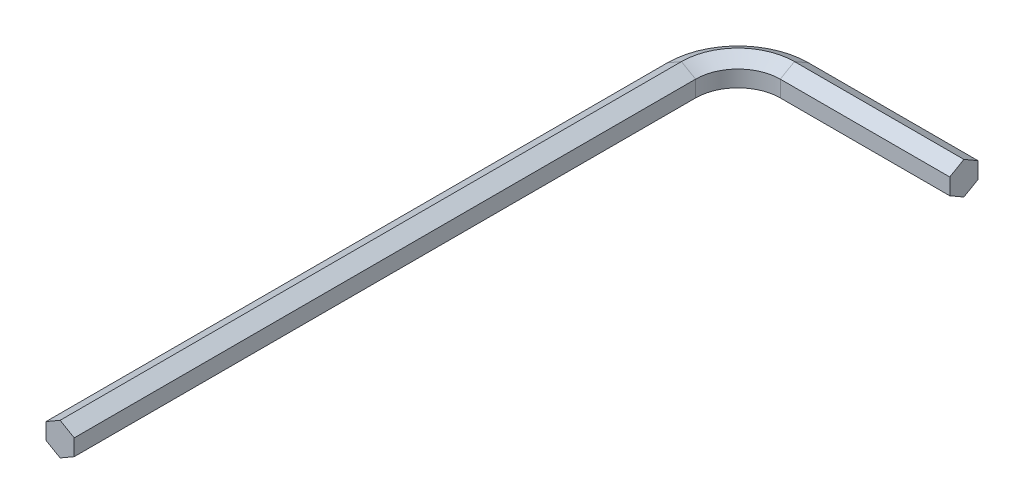
ISO-10303-21;
HEADER;
FILE_DESCRIPTION(('STEP AP214'),'2;1');
FILE_NAME('part.step','',(''),(''),'','','');
FILE_SCHEMA(('AUTOMOTIVE_DESIGN { 1 0 10303 214 1 1 1 1 }'));
ENDSEC;
DATA;
#1=APPLICATION_CONTEXT('core data for automotive mechanical design processes');
#2=APPLICATION_PROTOCOL_DEFINITION('international standard','automotive_design',2000,#1);
#3=PRODUCT_CONTEXT('',#1,'mechanical');
#4=PRODUCT('Part','Part','',(#3));
#5=PRODUCT_RELATED_PRODUCT_CATEGORY('part','',(#4));
#6=PRODUCT_DEFINITION_FORMATION('','',#4);
#7=PRODUCT_DEFINITION_CONTEXT('part definition',#1,'design');
#8=PRODUCT_DEFINITION('design','',#6,#7);
#9=PRODUCT_DEFINITION_SHAPE('','',#8);
#10=(LENGTH_UNIT() NAMED_UNIT(*) SI_UNIT(.MILLI.,.METRE.));
#11=(NAMED_UNIT(*) PLANE_ANGLE_UNIT() SI_UNIT($,.RADIAN.));
#12=(NAMED_UNIT(*) SI_UNIT($,.STERADIAN.) SOLID_ANGLE_UNIT());
#13=UNCERTAINTY_MEASURE_WITH_UNIT(LENGTH_MEASURE(1.E-05),#10,'distance_accuracy_value','');
#14=(GEOMETRIC_REPRESENTATION_CONTEXT(3) GLOBAL_UNCERTAINTY_ASSIGNED_CONTEXT((#13)) GLOBAL_UNIT_ASSIGNED_CONTEXT((#10,
#11,#12)) REPRESENTATION_CONTEXT('',''));
#15=CARTESIAN_POINT('',(0.,0.,0.));
#16=DIRECTION('',(0.,0.,1.));
#17=DIRECTION('',(1.,0.,0.));
#18=AXIS2_PLACEMENT_3D('',#15,#16,#17);
#19=CARTESIAN_POINT('',(5.,-0.721687836487033,-58.75));
#20=DIRECTION('',(0.,0.,-1.));
#21=DIRECTION('',(-1.,0.,0.));
#22=AXIS2_PLACEMENT_3D('',#19,#20,#21);
#23=PLANE('',#22);
#24=DIRECTION('',(0.,1.,0.));
#25=VECTOR('',#24,1.);
#26=CARTESIAN_POINT('',(5.,-0.721687836487033,-58.75));
#27=LINE('',#26,#25);
#28=CARTESIAN_POINT('',(5.,-0.721687836487033,-58.75));
#29=VERTEX_POINT('',#28);
#30=CARTESIAN_POINT('',(5.,0.721687836487033,-58.75));
#31=VERTEX_POINT('',#30);
#32=EDGE_CURVE('E135',#29,#31,#27,.T.);
#33=ORIENTED_EDGE('',*,*,#32,.F.);
#34=DIRECTION('',(1.,0.,0.));
#35=VECTOR('',#34,1.);
#36=CARTESIAN_POINT('',(5.,-0.721687836487033,-58.75));
#37=LINE('',#36,#35);
#38=CARTESIAN_POINT('',(20.,-0.721687836487033,-58.75));
#39=VERTEX_POINT('',#38);
#40=EDGE_CURVE('E40',#29,#39,#37,.T.);
#41=ORIENTED_EDGE('',*,*,#40,.T.);
#42=DIRECTION('',(0.,1.,0.));
#43=VECTOR('',#42,1.);
#44=CARTESIAN_POINT('',(20.,-0.721687836487033,-58.75));
#45=LINE('',#44,#43);
#46=CARTESIAN_POINT('',(20.,0.721687836487033,-58.75));
#47=VERTEX_POINT('',#46);
#48=EDGE_CURVE('E47',#39,#47,#45,.T.);
#49=ORIENTED_EDGE('',*,*,#48,.T.);
#50=DIRECTION('',(1.,0.,0.));
#51=VECTOR('',#50,1.);
#52=CARTESIAN_POINT('',(5.,0.721687836487033,-58.75));
#53=LINE('',#52,#51);
#54=EDGE_CURVE('E11',#31,#47,#53,.T.);
#55=ORIENTED_EDGE('',*,*,#54,.F.);
#56=EDGE_LOOP('',(#33,#41,#49,#55));
#57=FACE_BOUND('',#56,.T.);
#58=ADVANCED_FACE('F33',(#57),#23,.F.);
#59=CARTESIAN_POINT('',(5.,-1.44337567297407,-60.));
#60=DIRECTION('',(0.,0.866025403784439,-0.5));
#61=DIRECTION('',(0.,0.5,0.866025403784439));
#62=AXIS2_PLACEMENT_3D('',#59,#60,#61);
#63=PLANE('',#62);
#64=DIRECTION('',(0.,0.5,0.866025403784439));
#65=VECTOR('',#64,1.);
#66=CARTESIAN_POINT('',(5.,-1.44337567297407,-60.));
#67=LINE('',#66,#65);
#68=CARTESIAN_POINT('',(5.,-1.44337567297407,-60.));
#69=VERTEX_POINT('',#68);
#70=EDGE_CURVE('E203',#69,#29,#67,.T.);
#71=ORIENTED_EDGE('',*,*,#70,.F.);
#72=DIRECTION('',(1.,0.,0.));
#73=VECTOR('',#72,1.);
#74=CARTESIAN_POINT('',(5.,-1.44337567297407,-60.));
#75=LINE('',#74,#73);
#76=CARTESIAN_POINT('',(20.,-1.44337567297407,-60.));
#77=VERTEX_POINT('',#76);
#78=EDGE_CURVE('E239',#69,#77,#75,.T.);
#79=ORIENTED_EDGE('',*,*,#78,.T.);
#80=DIRECTION('',(0.,0.5,0.866025403784439));
#81=VECTOR('',#80,1.);
#82=CARTESIAN_POINT('',(20.,-1.44337567297407,-60.));
#83=LINE('',#82,#81);
#84=EDGE_CURVE('E55',#77,#39,#83,.T.);
#85=ORIENTED_EDGE('',*,*,#84,.T.);
#86=ORIENTED_EDGE('',*,*,#40,.F.);
#87=EDGE_LOOP('',(#71,#79,#85,#86));
#88=FACE_BOUND('',#87,.T.);
#89=ADVANCED_FACE('F242',(#88),#63,.F.);
#90=CARTESIAN_POINT('',(5.,-0.721687836487033,-61.25));
#91=DIRECTION('',(0.,0.866025403784439,0.5));
#92=DIRECTION('',(0.,-0.5,0.866025403784439));
#93=AXIS2_PLACEMENT_3D('',#90,#91,#92);
#94=PLANE('',#93);
#95=DIRECTION('',(0.,-0.5,0.866025403784439));
#96=VECTOR('',#95,1.);
#97=CARTESIAN_POINT('',(5.,-0.721687836487033,-61.25));
#98=LINE('',#97,#96);
#99=CARTESIAN_POINT('',(5.,-0.721687836487033,-61.25));
#100=VERTEX_POINT('',#99);
#101=EDGE_CURVE('E200',#100,#69,#98,.T.);
#102=ORIENTED_EDGE('',*,*,#101,.F.);
#103=DIRECTION('',(1.,0.,0.));
#104=VECTOR('',#103,1.);
#105=CARTESIAN_POINT('',(5.,-0.721687836487033,-61.25));
#106=LINE('',#105,#104);
#107=CARTESIAN_POINT('',(20.,-0.721687836487033,-61.25));
#108=VERTEX_POINT('',#107);
#109=EDGE_CURVE('E236',#100,#108,#106,.T.);
#110=ORIENTED_EDGE('',*,*,#109,.T.);
#111=DIRECTION('',(0.,-0.5,0.866025403784439));
#112=VECTOR('',#111,1.);
#113=CARTESIAN_POINT('',(20.,-0.721687836487033,-61.25));
#114=LINE('',#113,#112);
#115=EDGE_CURVE('E226',#108,#77,#114,.T.);
#116=ORIENTED_EDGE('',*,*,#115,.T.);
#117=ORIENTED_EDGE('',*,*,#78,.F.);
#118=EDGE_LOOP('',(#102,#110,#116,#117));
#119=FACE_BOUND('',#118,.T.);
#120=ADVANCED_FACE('F277',(#119),#94,.F.);
#121=CARTESIAN_POINT('',(5.,0.721687836487033,-61.25));
#122=DIRECTION('',(0.,0.,1.));
#123=DIRECTION('',(1.,0.,0.));
#124=AXIS2_PLACEMENT_3D('',#121,#122,#123);
#125=PLANE('',#124);
#126=DIRECTION('',(0.,-1.,0.));
#127=VECTOR('',#126,1.);
#128=CARTESIAN_POINT('',(5.,0.721687836487033,-61.25));
#129=LINE('',#128,#127);
#130=CARTESIAN_POINT('',(5.,0.721687836487033,-61.25));
#131=VERTEX_POINT('',#130);
#132=EDGE_CURVE('E197',#131,#100,#129,.T.);
#133=ORIENTED_EDGE('',*,*,#132,.F.);
#134=DIRECTION('',(1.,0.,0.));
#135=VECTOR('',#134,1.);
#136=CARTESIAN_POINT('',(5.,0.721687836487033,-61.25));
#137=LINE('',#136,#135);
#138=CARTESIAN_POINT('',(20.,0.721687836487033,-61.25));
#139=VERTEX_POINT('',#138);
#140=EDGE_CURVE('E233',#131,#139,#137,.T.);
#141=ORIENTED_EDGE('',*,*,#140,.T.);
#142=DIRECTION('',(0.,-1.,0.));
#143=VECTOR('',#142,1.);
#144=CARTESIAN_POINT('',(20.,0.721687836487033,-61.25));
#145=LINE('',#144,#143);
#146=EDGE_CURVE('E224',#139,#108,#145,.T.);
#147=ORIENTED_EDGE('',*,*,#146,.T.);
#148=ORIENTED_EDGE('',*,*,#109,.F.);
#149=EDGE_LOOP('',(#133,#141,#147,#148));
#150=FACE_BOUND('',#149,.T.);
#151=ADVANCED_FACE('F268',(#150),#125,.F.);
#152=CARTESIAN_POINT('',(5.,1.44337567297407,-60.));
#153=DIRECTION('',(0.,-0.866025403784439,0.5));
#154=DIRECTION('',(0.,-0.5,-0.866025403784439));
#155=AXIS2_PLACEMENT_3D('',#152,#153,#154);
#156=PLANE('',#155);
#157=DIRECTION('',(0.,-0.5,-0.866025403784439));
#158=VECTOR('',#157,1.);
#159=CARTESIAN_POINT('',(5.,1.44337567297407,-60.));
#160=LINE('',#159,#158);
#161=CARTESIAN_POINT('',(5.,1.44337567297407,-60.));
#162=VERTEX_POINT('',#161);
#163=EDGE_CURVE('E195',#162,#131,#160,.T.);
#164=ORIENTED_EDGE('',*,*,#163,.F.);
#165=DIRECTION('',(1.,0.,0.));
#166=VECTOR('',#165,1.);
#167=CARTESIAN_POINT('',(5.,1.44337567297407,-60.));
#168=LINE('',#167,#166);
#169=CARTESIAN_POINT('',(20.,1.44337567297407,-60.));
#170=VERTEX_POINT('',#169);
#171=EDGE_CURVE('E230',#162,#170,#168,.T.);
#172=ORIENTED_EDGE('',*,*,#171,.T.);
#173=DIRECTION('',(0.,-0.5,-0.866025403784439));
#174=VECTOR('',#173,1.);
#175=CARTESIAN_POINT('',(20.,1.44337567297407,-60.));
#176=LINE('',#175,#174);
#177=EDGE_CURVE('E222',#170,#139,#176,.T.);
#178=ORIENTED_EDGE('',*,*,#177,.T.);
#179=ORIENTED_EDGE('',*,*,#140,.F.);
#180=EDGE_LOOP('',(#164,#172,#178,#179));
#181=FACE_BOUND('',#180,.T.);
#182=ADVANCED_FACE('F271',(#181),#156,.F.);
#183=CARTESIAN_POINT('',(5.,0.721687836487033,-58.75));
#184=DIRECTION('',(0.,-0.866025403784439,-0.5));
#185=DIRECTION('',(0.,0.5,-0.866025403784439));
#186=AXIS2_PLACEMENT_3D('',#183,#184,#185);
#187=PLANE('',#186);
#188=DIRECTION('',(0.,0.5,-0.866025403784439));
#189=VECTOR('',#188,1.);
#190=CARTESIAN_POINT('',(5.,0.721687836487033,-58.75));
#191=LINE('',#190,#189);
#192=EDGE_CURVE('E131',#31,#162,#191,.T.);
#193=ORIENTED_EDGE('',*,*,#192,.F.);
#194=ORIENTED_EDGE('',*,*,#54,.T.);
#195=DIRECTION('',(0.,0.5,-0.866025403784439));
#196=VECTOR('',#195,1.);
#197=CARTESIAN_POINT('',(20.,0.721687836487033,-58.75));
#198=LINE('',#197,#196);
#199=EDGE_CURVE('E220',#47,#170,#198,.T.);
#200=ORIENTED_EDGE('',*,*,#199,.T.);
#201=ORIENTED_EDGE('',*,*,#171,.F.);
#202=EDGE_LOOP('',(#193,#194,#200,#201));
#203=FACE_BOUND('',#202,.T.);
#204=ADVANCED_FACE('F311',(#203),#187,.F.);
#205=CARTESIAN_POINT('',(5.,0.,-55.));
#206=DIRECTION('',(0.,-1.,0.));
#207=DIRECTION('',(0.,0.,-1.));
#208=AXIS2_PLACEMENT_3D('',#205,#206,#207);
#209=CYLINDRICAL_SURFACE('',#208,3.75);
#210=DIRECTION('',(0.,1.,0.));
#211=VECTOR('',#210,1.);
#212=CARTESIAN_POINT('',(1.25,-0.721687836487033,-55.));
#213=LINE('',#212,#211);
#214=CARTESIAN_POINT('',(1.25,-0.721687836487033,-55.));
#215=VERTEX_POINT('',#214);
#216=CARTESIAN_POINT('',(1.25,0.721687836487033,-55.));
#217=VERTEX_POINT('',#216);
#218=EDGE_CURVE('E155',#215,#217,#213,.T.);
#219=ORIENTED_EDGE('',*,*,#218,.F.);
#220=CARTESIAN_POINT('',(5.,-0.721687836487033,-55.));
#221=DIRECTION('',(0.,-1.,0.));
#222=DIRECTION('',(0.,0.,-1.));
#223=AXIS2_PLACEMENT_3D('',#220,#221,#222);
#224=CIRCLE('',#223,3.75);
#225=EDGE_CURVE('E215',#215,#29,#224,.T.);
#226=ORIENTED_EDGE('',*,*,#225,.T.);
#227=ORIENTED_EDGE('',*,*,#32,.T.);
#228=CARTESIAN_POINT('',(5.,0.721687836487033,-55.));
#229=DIRECTION('',(0.,-1.,0.));
#230=DIRECTION('',(0.,0.,-1.));
#231=AXIS2_PLACEMENT_3D('',#228,#229,#230);
#232=CIRCLE('',#231,3.75);
#233=EDGE_CURVE('E218',#217,#31,#232,.T.);
#234=ORIENTED_EDGE('',*,*,#233,.F.);
#235=EDGE_LOOP('',(#219,#226,#227,#234));
#236=FACE_BOUND('',#235,.T.);
#237=ADVANCED_FACE('F320',(#236),#209,.F.);
#238=CARTESIAN_POINT('',(5.,-1.44337567297407,-55.));
#239=DIRECTION('',(0.,-1.,0.));
#240=DIRECTION('',(0.,0.,-1.));
#241=AXIS2_PLACEMENT_3D('',#238,#239,#240);
#242=CONICAL_SURFACE('',#241,5.,1.0471975511966);
#243=DIRECTION('',(0.866025403784439,0.5,0.));
#244=VECTOR('',#243,1.);
#245=CARTESIAN_POINT('',(0.,-1.44337567297407,-55.));
#246=LINE('',#245,#244);
#247=CARTESIAN_POINT('',(0.,-1.44337567297407,-55.));
#248=VERTEX_POINT('',#247);
#249=EDGE_CURVE('E171',#248,#215,#246,.T.);
#250=ORIENTED_EDGE('',*,*,#249,.F.);
#251=CARTESIAN_POINT('',(5.,-1.44337567297407,-55.));
#252=DIRECTION('',(0.,-1.,0.));
#253=DIRECTION('',(0.,0.,-1.));
#254=AXIS2_PLACEMENT_3D('',#251,#252,#253);
#255=CIRCLE('',#254,5.);
#256=EDGE_CURVE('E212',#248,#69,#255,.T.);
#257=ORIENTED_EDGE('',*,*,#256,.T.);
#258=ORIENTED_EDGE('',*,*,#70,.T.);
#259=ORIENTED_EDGE('',*,*,#225,.F.);
#260=EDGE_LOOP('',(#250,#257,#258,#259));
#261=FACE_BOUND('',#260,.T.);
#262=ADVANCED_FACE('F250',(#261),#242,.F.);
#263=CARTESIAN_POINT('',(5.,-0.721687836487033,-55.));
#264=DIRECTION('',(0.,1.,0.));
#265=DIRECTION('',(0.,0.,1.));
#266=AXIS2_PLACEMENT_3D('',#263,#264,#265);
#267=CONICAL_SURFACE('',#266,6.25,1.0471975511966);
#268=DIRECTION('',(0.866025403784439,-0.5,0.));
#269=VECTOR('',#268,1.);
#270=CARTESIAN_POINT('',(-1.25,-0.721687836487033,-55.));
#271=LINE('',#270,#269);
#272=CARTESIAN_POINT('',(-1.25,-0.721687836487033,-55.));
#273=VERTEX_POINT('',#272);
#274=EDGE_CURVE('E168',#273,#248,#271,.T.);
#275=ORIENTED_EDGE('',*,*,#274,.F.);
#276=CARTESIAN_POINT('',(5.,-0.721687836487033,-55.));
#277=DIRECTION('',(0.,-1.,0.));
#278=DIRECTION('',(0.,0.,-1.));
#279=AXIS2_PLACEMENT_3D('',#276,#277,#278);
#280=CIRCLE('',#279,6.25);
#281=EDGE_CURVE('E209',#273,#100,#280,.T.);
#282=ORIENTED_EDGE('',*,*,#281,.T.);
#283=ORIENTED_EDGE('',*,*,#101,.T.);
#284=ORIENTED_EDGE('',*,*,#256,.F.);
#285=EDGE_LOOP('',(#275,#282,#283,#284));
#286=FACE_BOUND('',#285,.T.);
#287=ADVANCED_FACE('F247',(#286),#267,.T.);
#288=CARTESIAN_POINT('',(5.,0.,-55.));
#289=DIRECTION('',(0.,-1.,0.));
#290=DIRECTION('',(0.,0.,-1.));
#291=AXIS2_PLACEMENT_3D('',#288,#289,#290);
#292=CYLINDRICAL_SURFACE('',#291,6.25);
#293=DIRECTION('',(0.,-1.,0.));
#294=VECTOR('',#293,1.);
#295=CARTESIAN_POINT('',(-1.25,0.721687836487033,-55.));
#296=LINE('',#295,#294);
#297=CARTESIAN_POINT('',(-1.25,0.721687836487033,-55.));
#298=VERTEX_POINT('',#297);
#299=EDGE_CURVE('E144',#298,#273,#296,.T.);
#300=ORIENTED_EDGE('',*,*,#299,.F.);
#301=CARTESIAN_POINT('',(5.,0.721687836487033,-55.));
#302=DIRECTION('',(0.,-1.,0.));
#303=DIRECTION('',(0.,0.,-1.));
#304=AXIS2_PLACEMENT_3D('',#301,#302,#303);
#305=CIRCLE('',#304,6.25);
#306=EDGE_CURVE('E134',#298,#131,#305,.T.);
#307=ORIENTED_EDGE('',*,*,#306,.T.);
#308=ORIENTED_EDGE('',*,*,#132,.T.);
#309=ORIENTED_EDGE('',*,*,#281,.F.);
#310=EDGE_LOOP('',(#300,#307,#308,#309));
#311=FACE_BOUND('',#310,.T.);
#312=ADVANCED_FACE('F265',(#311),#292,.T.);
#313=CARTESIAN_POINT('',(5.,1.44337567297407,-55.));
#314=DIRECTION('',(0.,-1.,0.));
#315=DIRECTION('',(0.,0.,-1.));
#316=AXIS2_PLACEMENT_3D('',#313,#314,#315);
#317=CONICAL_SURFACE('',#316,5.,1.0471975511966);
#318=DIRECTION('',(-0.866025403784439,-0.5,0.));
#319=VECTOR('',#318,1.);
#320=CARTESIAN_POINT('',(0.,1.44337567297407,-55.));
#321=LINE('',#320,#319);
#322=CARTESIAN_POINT('',(0.,1.44337567297407,-55.));
#323=VERTEX_POINT('',#322);
#324=EDGE_CURVE('E138',#323,#298,#321,.T.);
#325=ORIENTED_EDGE('',*,*,#324,.F.);
#326=CARTESIAN_POINT('',(5.,1.44337567297407,-55.));
#327=DIRECTION('',(0.,-1.,0.));
#328=DIRECTION('',(0.,0.,-1.));
#329=AXIS2_PLACEMENT_3D('',#326,#327,#328);
#330=CIRCLE('',#329,5.);
#331=EDGE_CURVE('E123',#323,#162,#330,.T.);
#332=ORIENTED_EDGE('',*,*,#331,.T.);
#333=ORIENTED_EDGE('',*,*,#163,.T.);
#334=ORIENTED_EDGE('',*,*,#306,.F.);
#335=EDGE_LOOP('',(#325,#332,#333,#334));
#336=FACE_BOUND('',#335,.T.);
#337=ADVANCED_FACE('F140',(#336),#317,.T.);
#338=CARTESIAN_POINT('',(5.,0.721687836487033,-55.));
#339=DIRECTION('',(0.,1.,0.));
#340=DIRECTION('',(0.,0.,1.));
#341=AXIS2_PLACEMENT_3D('',#338,#339,#340);
#342=CONICAL_SURFACE('',#341,3.75,1.0471975511966);
#343=DIRECTION('',(-0.866025403784439,0.5,0.));
#344=VECTOR('',#343,1.);
#345=CARTESIAN_POINT('',(1.25,0.721687836487033,-55.));
#346=LINE('',#345,#344);
#347=EDGE_CURVE('E128',#217,#323,#346,.T.);
#348=ORIENTED_EDGE('',*,*,#347,.F.);
#349=ORIENTED_EDGE('',*,*,#233,.T.);
#350=ORIENTED_EDGE('',*,*,#192,.T.);
#351=ORIENTED_EDGE('',*,*,#331,.F.);
#352=EDGE_LOOP('',(#348,#349,#350,#351));
#353=FACE_BOUND('',#352,.T.);
#354=ADVANCED_FACE('F125',(#353),#342,.F.);
#355=CARTESIAN_POINT('',(1.25,0.721687836487033,-55.));
#356=DIRECTION('',(0.5,0.866025403784439,0.));
#357=DIRECTION('',(-0.866025403784439,0.5,0.));
#358=AXIS2_PLACEMENT_3D('',#355,#356,#357);
#359=PLANE('',#358);
#360=DIRECTION('',(-0.866025403784439,0.5,0.));
#361=VECTOR('',#360,1.);
#362=CARTESIAN_POINT('',(1.25,0.721687836487033,0.));
#363=LINE('',#362,#361);
#364=CARTESIAN_POINT('',(1.25,0.721687836487033,0.));
#365=VERTEX_POINT('',#364);
#366=CARTESIAN_POINT('',(0.,1.44337567297407,0.));
#367=VERTEX_POINT('',#366);
#368=EDGE_CURVE('E175',#365,#367,#363,.T.);
#369=ORIENTED_EDGE('',*,*,#368,.F.);
#370=DIRECTION('',(0.,0.,1.));
#371=VECTOR('',#370,1.);
#372=CARTESIAN_POINT('',(1.25,0.721687836487033,-55.));
#373=LINE('',#372,#371);
#374=EDGE_CURVE('E158',#217,#365,#373,.T.);
#375=ORIENTED_EDGE('',*,*,#374,.F.);
#376=ORIENTED_EDGE('',*,*,#347,.T.);
#377=DIRECTION('',(0.,0.,1.));
#378=VECTOR('',#377,1.);
#379=CARTESIAN_POINT('',(0.,1.44337567297407,-55.));
#380=LINE('',#379,#378);
#381=EDGE_CURVE('E147',#323,#367,#380,.T.);
#382=ORIENTED_EDGE('',*,*,#381,.T.);
#383=EDGE_LOOP('',(#369,#375,#376,#382));
#384=FACE_BOUND('',#383,.T.);
#385=ADVANCED_FACE('F157',(#384),#359,.T.);
#386=CARTESIAN_POINT('',(1.25,-0.721687836487033,-55.));
#387=DIRECTION('',(1.,0.,0.));
#388=DIRECTION('',(0.,0.,-1.));
#389=AXIS2_PLACEMENT_3D('',#386,#387,#388);
#390=PLANE('',#389);
#391=DIRECTION('',(0.,1.,0.));
#392=VECTOR('',#391,1.);
#393=CARTESIAN_POINT('',(1.25,-0.721687836487033,0.));
#394=LINE('',#393,#392);
#395=CARTESIAN_POINT('',(1.25,-0.721687836487033,0.));
#396=VERTEX_POINT('',#395);
#397=EDGE_CURVE('E160',#396,#365,#394,.T.);
#398=ORIENTED_EDGE('',*,*,#397,.F.);
#399=DIRECTION('',(0.,0.,1.));
#400=VECTOR('',#399,1.);
#401=CARTESIAN_POINT('',(1.25,-0.721687836487033,-55.));
#402=LINE('',#401,#400);
#403=EDGE_CURVE('E187',#215,#396,#402,.T.);
#404=ORIENTED_EDGE('',*,*,#403,.F.);
#405=ORIENTED_EDGE('',*,*,#218,.T.);
#406=ORIENTED_EDGE('',*,*,#374,.T.);
#407=EDGE_LOOP('',(#398,#404,#405,#406));
#408=FACE_BOUND('',#407,.T.);
#409=ADVANCED_FACE('F379',(#408),#390,.T.);
#410=CARTESIAN_POINT('',(0.,-1.44337567297407,-55.));
#411=DIRECTION('',(0.5,-0.866025403784439,0.));
#412=DIRECTION('',(0.866025403784439,0.5,0.));
#413=AXIS2_PLACEMENT_3D('',#410,#411,#412);
#414=PLANE('',#413);
#415=DIRECTION('',(0.866025403784439,0.5,0.));
#416=VECTOR('',#415,1.);
#417=CARTESIAN_POINT('',(0.,-1.44337567297407,0.));
#418=LINE('',#417,#416);
#419=CARTESIAN_POINT('',(0.,-1.44337567297407,0.));
#420=VERTEX_POINT('',#419);
#421=EDGE_CURVE('E163',#420,#396,#418,.T.);
#422=ORIENTED_EDGE('',*,*,#421,.F.);
#423=DIRECTION('',(0.,0.,1.));
#424=VECTOR('',#423,1.);
#425=CARTESIAN_POINT('',(0.,-1.44337567297407,-55.));
#426=LINE('',#425,#424);
#427=EDGE_CURVE('E189',#248,#420,#426,.T.);
#428=ORIENTED_EDGE('',*,*,#427,.F.);
#429=ORIENTED_EDGE('',*,*,#249,.T.);
#430=ORIENTED_EDGE('',*,*,#403,.T.);
#431=EDGE_LOOP('',(#422,#428,#429,#430));
#432=FACE_BOUND('',#431,.T.);
#433=ADVANCED_FACE('F255',(#432),#414,.T.);
#434=CARTESIAN_POINT('',(-1.25,-0.721687836487033,-55.));
#435=DIRECTION('',(-0.5,-0.866025403784439,0.));
#436=DIRECTION('',(0.866025403784439,-0.5,0.));
#437=AXIS2_PLACEMENT_3D('',#434,#435,#436);
#438=PLANE('',#437);
#439=DIRECTION('',(0.866025403784439,-0.5,0.));
#440=VECTOR('',#439,1.);
#441=CARTESIAN_POINT('',(-1.25,-0.721687836487033,0.));
#442=LINE('',#441,#440);
#443=CARTESIAN_POINT('',(-1.25,-0.721687836487033,0.));
#444=VERTEX_POINT('',#443);
#445=EDGE_CURVE('E181',#444,#420,#442,.T.);
#446=ORIENTED_EDGE('',*,*,#445,.F.);
#447=DIRECTION('',(0.,0.,1.));
#448=VECTOR('',#447,1.);
#449=CARTESIAN_POINT('',(-1.25,-0.721687836487033,-55.));
#450=LINE('',#449,#448);
#451=EDGE_CURVE('E191',#273,#444,#450,.T.);
#452=ORIENTED_EDGE('',*,*,#451,.F.);
#453=ORIENTED_EDGE('',*,*,#274,.T.);
#454=ORIENTED_EDGE('',*,*,#427,.T.);
#455=EDGE_LOOP('',(#446,#452,#453,#454));
#456=FACE_BOUND('',#455,.T.);
#457=ADVANCED_FACE('F259',(#456),#438,.T.);
#458=CARTESIAN_POINT('',(-1.25,0.721687836487033,-55.));
#459=DIRECTION('',(-1.,0.,0.));
#460=DIRECTION('',(0.,0.,1.));
#461=AXIS2_PLACEMENT_3D('',#458,#459,#460);
#462=PLANE('',#461);
#463=DIRECTION('',(0.,-1.,0.));
#464=VECTOR('',#463,1.);
#465=CARTESIAN_POINT('',(-1.25,0.721687836487033,0.));
#466=LINE('',#465,#464);
#467=CARTESIAN_POINT('',(-1.25,0.721687836487033,0.));
#468=VERTEX_POINT('',#467);
#469=EDGE_CURVE('E178',#468,#444,#466,.T.);
#470=ORIENTED_EDGE('',*,*,#469,.F.);
#471=DIRECTION('',(0.,0.,1.));
#472=VECTOR('',#471,1.);
#473=CARTESIAN_POINT('',(-1.25,0.721687836487033,-55.));
#474=LINE('',#473,#472);
#475=EDGE_CURVE('E154',#298,#468,#474,.T.);
#476=ORIENTED_EDGE('',*,*,#475,.F.);
#477=ORIENTED_EDGE('',*,*,#299,.T.);
#478=ORIENTED_EDGE('',*,*,#451,.T.);
#479=EDGE_LOOP('',(#470,#476,#477,#478));
#480=FACE_BOUND('',#479,.T.);
#481=ADVANCED_FACE('F263',(#480),#462,.T.);
#482=CARTESIAN_POINT('',(0.,1.44337567297407,-55.));
#483=DIRECTION('',(-0.5,0.866025403784439,0.));
#484=DIRECTION('',(-0.866025403784439,-0.5,0.));
#485=AXIS2_PLACEMENT_3D('',#482,#483,#484);
#486=PLANE('',#485);
#487=DIRECTION('',(-0.866025403784439,-0.5,0.));
#488=VECTOR('',#487,1.);
#489=CARTESIAN_POINT('',(0.,1.44337567297407,0.));
#490=LINE('',#489,#488);
#491=EDGE_CURVE('E150',#367,#468,#490,.T.);
#492=ORIENTED_EDGE('',*,*,#491,.F.);
#493=ORIENTED_EDGE('',*,*,#381,.F.);
#494=ORIENTED_EDGE('',*,*,#324,.T.);
#495=ORIENTED_EDGE('',*,*,#475,.T.);
#496=EDGE_LOOP('',(#492,#493,#494,#495));
#497=FACE_BOUND('',#496,.T.);
#498=ADVANCED_FACE('F148',(#497),#486,.T.);
#499=CARTESIAN_POINT('',(20.,0.,-60.));
#500=DIRECTION('',(-1.,0.,0.));
#501=DIRECTION('',(0.,0.,1.));
#502=AXIS2_PLACEMENT_3D('',#499,#500,#501);
#503=PLANE('',#502);
#504=ORIENTED_EDGE('',*,*,#199,.F.);
#505=ORIENTED_EDGE('',*,*,#48,.F.);
#506=ORIENTED_EDGE('',*,*,#84,.F.);
#507=ORIENTED_EDGE('',*,*,#115,.F.);
#508=ORIENTED_EDGE('',*,*,#146,.F.);
#509=ORIENTED_EDGE('',*,*,#177,.F.);
#510=EDGE_LOOP('',(#504,#505,#506,#507,#508,#509));
#511=FACE_BOUND('',#510,.T.);
#512=ADVANCED_FACE('F276',(#511),#503,.F.);
#513=CARTESIAN_POINT('',(0.,0.,0.));
#514=DIRECTION('',(0.,0.,1.));
#515=DIRECTION('',(1.,0.,0.));
#516=AXIS2_PLACEMENT_3D('',#513,#514,#515);
#517=PLANE('',#516);
#518=ORIENTED_EDGE('',*,*,#368,.T.);
#519=ORIENTED_EDGE('',*,*,#491,.T.);
#520=ORIENTED_EDGE('',*,*,#469,.T.);
#521=ORIENTED_EDGE('',*,*,#445,.T.);
#522=ORIENTED_EDGE('',*,*,#421,.T.);
#523=ORIENTED_EDGE('',*,*,#397,.T.);
#524=EDGE_LOOP('',(#518,#519,#520,#521,#522,#523));
#525=FACE_BOUND('',#524,.T.);
#526=ADVANCED_FACE('F429',(#525),#517,.T.);
#527=CLOSED_SHELL('',(#58,#89,#120,#151,#182,#204,#237,#262,#287,#312,#337,#354,#385,#409,#433,
#457,#481,#498,#512,#526));
#528=MANIFOLD_SOLID_BREP('B2',#527);
#529=ADVANCED_BREP_SHAPE_REPRESENTATION('',(#18,#528),#14);
#530=SHAPE_DEFINITION_REPRESENTATION(#9,#529);
ENDSEC;
END-ISO-10303-21;
